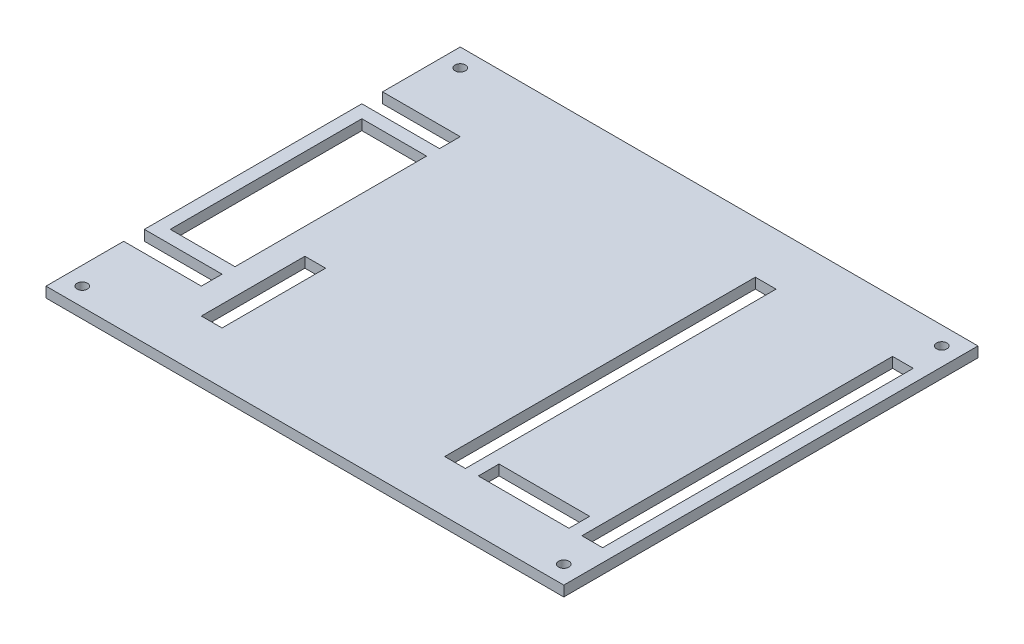
ISO-10303-21;
HEADER;
FILE_DESCRIPTION(('STEP AP214'),'2;1');
FILE_NAME('part.step','',(''),(''),'','','');
FILE_SCHEMA(('AUTOMOTIVE_DESIGN { 1 0 10303 214 1 1 1 1 }'));
ENDSEC;
DATA;
#1=APPLICATION_CONTEXT('core data for automotive mechanical design processes');
#2=APPLICATION_PROTOCOL_DEFINITION('international standard','automotive_design',2000,#1);
#3=PRODUCT_CONTEXT('',#1,'mechanical');
#4=PRODUCT('Part','Part','',(#3));
#5=PRODUCT_RELATED_PRODUCT_CATEGORY('part','',(#4));
#6=PRODUCT_DEFINITION_FORMATION('','',#4);
#7=PRODUCT_DEFINITION_CONTEXT('part definition',#1,'design');
#8=PRODUCT_DEFINITION('design','',#6,#7);
#9=PRODUCT_DEFINITION_SHAPE('','',#8);
#10=(LENGTH_UNIT() NAMED_UNIT(*) SI_UNIT(.MILLI.,.METRE.));
#11=(NAMED_UNIT(*) PLANE_ANGLE_UNIT() SI_UNIT($,.RADIAN.));
#12=(NAMED_UNIT(*) SI_UNIT($,.STERADIAN.) SOLID_ANGLE_UNIT());
#13=UNCERTAINTY_MEASURE_WITH_UNIT(LENGTH_MEASURE(1.E-05),#10,'distance_accuracy_value','');
#14=(GEOMETRIC_REPRESENTATION_CONTEXT(3) GLOBAL_UNCERTAINTY_ASSIGNED_CONTEXT((#13)) GLOBAL_UNIT_ASSIGNED_CONTEXT((#10,
#11,#12)) REPRESENTATION_CONTEXT('',''));
#15=CARTESIAN_POINT('',(0.,0.,0.));
#16=DIRECTION('',(0.,0.,1.));
#17=DIRECTION('',(1.,0.,0.));
#18=AXIS2_PLACEMENT_3D('',#15,#16,#17);
#19=CARTESIAN_POINT('',(-100.,4.,-80.));
#20=DIRECTION('',(1.,0.,0.));
#21=DIRECTION('',(0.,0.,-1.));
#22=AXIS2_PLACEMENT_3D('',#19,#20,#21);
#23=PLANE('',#22);
#24=DIRECTION('',(0.,0.,1.));
#25=VECTOR('',#24,1.);
#26=CARTESIAN_POINT('',(-100.,4.,-80.));
#27=LINE('',#26,#25);
#28=CARTESIAN_POINT('',(-100.,4.,50.));
#29=VERTEX_POINT('',#28);
#30=CARTESIAN_POINT('',(-100.,4.,80.));
#31=VERTEX_POINT('',#30);
#32=EDGE_CURVE('E478',#29,#31,#27,.T.);
#33=ORIENTED_EDGE('',*,*,#32,.F.);
#34=DIRECTION('',(0.,-1.,0.));
#35=VECTOR('',#34,1.);
#36=CARTESIAN_POINT('',(-100.,329.195252931707,50.));
#37=LINE('',#36,#35);
#38=CARTESIAN_POINT('',(-100.,0.,50.));
#39=VERTEX_POINT('',#38);
#40=EDGE_CURVE('E394',#29,#39,#37,.T.);
#41=ORIENTED_EDGE('',*,*,#40,.T.);
#42=DIRECTION('',(0.,0.,1.));
#43=VECTOR('',#42,1.);
#44=CARTESIAN_POINT('',(-100.,0.,-80.));
#45=LINE('',#44,#43);
#46=CARTESIAN_POINT('',(-100.,0.,80.));
#47=VERTEX_POINT('',#46);
#48=EDGE_CURVE('E470',#39,#47,#45,.T.);
#49=ORIENTED_EDGE('',*,*,#48,.T.);
#50=DIRECTION('',(0.,-1.,0.));
#51=VECTOR('',#50,1.);
#52=CARTESIAN_POINT('',(-100.,4.,80.));
#53=LINE('',#52,#51);
#54=EDGE_CURVE('E503',#31,#47,#53,.T.);
#55=ORIENTED_EDGE('',*,*,#54,.F.);
#56=EDGE_LOOP('',(#33,#41,#49,#55));
#57=FACE_BOUND('',#56,.T.);
#58=ADVANCED_FACE('F33',(#57),#23,.F.);
#59=CARTESIAN_POINT('',(0.,0.,0.));
#60=DIRECTION('',(0.,-1.,0.));
#61=DIRECTION('',(0.,0.,-1.));
#62=AXIS2_PLACEMENT_3D('',#59,#60,#61);
#63=PLANE('',#62);
#64=DIRECTION('',(0.,0.,-1.));
#65=VECTOR('',#64,1.);
#66=CARTESIAN_POINT('',(82.,0.,52.));
#67=LINE('',#66,#65);
#68=CARTESIAN_POINT('',(82.,0.,60.));
#69=VERTEX_POINT('',#68);
#70=CARTESIAN_POINT('',(82.,0.,52.));
#71=VERTEX_POINT('',#70);
#72=EDGE_CURVE('E244',#69,#71,#67,.T.);
#73=ORIENTED_EDGE('',*,*,#72,.T.);
#74=DIRECTION('',(-1.,0.,0.));
#75=VECTOR('',#74,1.);
#76=CARTESIAN_POINT('',(82.,0.,52.));
#77=LINE('',#76,#75);
#78=CARTESIAN_POINT('',(47.,0.,52.));
#79=VERTEX_POINT('',#78);
#80=EDGE_CURVE('E253',#71,#79,#77,.T.);
#81=ORIENTED_EDGE('',*,*,#80,.T.);
#82=DIRECTION('',(0.,0.,1.));
#83=VECTOR('',#82,1.);
#84=CARTESIAN_POINT('',(47.,0.,52.));
#85=LINE('',#84,#83);
#86=CARTESIAN_POINT('',(47.,0.,60.));
#87=VERTEX_POINT('',#86);
#88=EDGE_CURVE('E48',#79,#87,#85,.T.);
#89=ORIENTED_EDGE('',*,*,#88,.T.);
#90=DIRECTION('',(1.,0.,0.));
#91=VECTOR('',#90,1.);
#92=CARTESIAN_POINT('',(82.,0.,60.));
#93=LINE('',#92,#91);
#94=EDGE_CURVE('E250',#87,#69,#93,.T.);
#95=ORIENTED_EDGE('',*,*,#94,.T.);
#96=EDGE_LOOP('',(#73,#81,#89,#95));
#97=FACE_BOUND('',#96,.T.);
#98=DIRECTION('',(0.,0.,-1.));
#99=VECTOR('',#98,1.);
#100=CARTESIAN_POINT('',(-52.,0.,20.));
#101=LINE('',#100,#99);
#102=CARTESIAN_POINT('',(-52.,0.,60.));
#103=VERTEX_POINT('',#102);
#104=CARTESIAN_POINT('',(-52.,0.,20.));
#105=VERTEX_POINT('',#104);
#106=EDGE_CURVE('E279',#103,#105,#101,.T.);
#107=ORIENTED_EDGE('',*,*,#106,.T.);
#108=DIRECTION('',(-1.,0.,0.));
#109=VECTOR('',#108,1.);
#110=CARTESIAN_POINT('',(-52.,0.,20.));
#111=LINE('',#110,#109);
#112=CARTESIAN_POINT('',(-60.,0.,20.));
#113=VERTEX_POINT('',#112);
#114=EDGE_CURVE('E282',#105,#113,#111,.T.);
#115=ORIENTED_EDGE('',*,*,#114,.T.);
#116=DIRECTION('',(0.,0.,1.));
#117=VECTOR('',#116,1.);
#118=CARTESIAN_POINT('',(-60.,0.,20.));
#119=LINE('',#118,#117);
#120=CARTESIAN_POINT('',(-60.,0.,60.));
#121=VERTEX_POINT('',#120);
#122=EDGE_CURVE('E286',#113,#121,#119,.T.);
#123=ORIENTED_EDGE('',*,*,#122,.T.);
#124=DIRECTION('',(1.,0.,0.));
#125=VECTOR('',#124,1.);
#126=CARTESIAN_POINT('',(-52.,0.,60.));
#127=LINE('',#126,#125);
#128=EDGE_CURVE('E289',#121,#103,#127,.T.);
#129=ORIENTED_EDGE('',*,*,#128,.T.);
#130=EDGE_LOOP('',(#107,#115,#123,#129));
#131=FACE_BOUND('',#130,.T.);
#132=DIRECTION('',(0.,0.,1.));
#133=VECTOR('',#132,1.);
#134=CARTESIAN_POINT('',(34.,0.,-60.));
#135=LINE('',#134,#133);
#136=CARTESIAN_POINT('',(34.,0.,-60.));
#137=VERTEX_POINT('',#136);
#138=CARTESIAN_POINT('',(34.,0.,60.));
#139=VERTEX_POINT('',#138);
#140=EDGE_CURVE('E311',#137,#139,#135,.T.);
#141=ORIENTED_EDGE('',*,*,#140,.T.);
#142=DIRECTION('',(1.,0.,0.));
#143=VECTOR('',#142,1.);
#144=CARTESIAN_POINT('',(34.,0.,60.));
#145=LINE('',#144,#143);
#146=CARTESIAN_POINT('',(42.,0.,60.));
#147=VERTEX_POINT('',#146);
#148=EDGE_CURVE('E314',#139,#147,#145,.T.);
#149=ORIENTED_EDGE('',*,*,#148,.T.);
#150=DIRECTION('',(0.,0.,-1.));
#151=VECTOR('',#150,1.);
#152=CARTESIAN_POINT('',(42.,0.,-60.));
#153=LINE('',#152,#151);
#154=CARTESIAN_POINT('',(42.,0.,-60.));
#155=VERTEX_POINT('',#154);
#156=EDGE_CURVE('E318',#147,#155,#153,.T.);
#157=ORIENTED_EDGE('',*,*,#156,.T.);
#158=DIRECTION('',(-1.,0.,0.));
#159=VECTOR('',#158,1.);
#160=CARTESIAN_POINT('',(34.,0.,-60.));
#161=LINE('',#160,#159);
#162=EDGE_CURVE('E321',#155,#137,#161,.T.);
#163=ORIENTED_EDGE('',*,*,#162,.T.);
#164=EDGE_LOOP('',(#141,#149,#157,#163));
#165=FACE_BOUND('',#164,.T.);
#166=DIRECTION('',(-1.,0.,0.));
#167=VECTOR('',#166,1.);
#168=CARTESIAN_POINT('',(95.,0.,-60.));
#169=LINE('',#168,#167);
#170=CARTESIAN_POINT('',(95.,0.,-60.));
#171=VERTEX_POINT('',#170);
#172=CARTESIAN_POINT('',(87.,0.,-60.));
#173=VERTEX_POINT('',#172);
#174=EDGE_CURVE('E343',#171,#173,#169,.T.);
#175=ORIENTED_EDGE('',*,*,#174,.T.);
#176=DIRECTION('',(0.,0.,1.));
#177=VECTOR('',#176,1.);
#178=CARTESIAN_POINT('',(87.,0.,-60.));
#179=LINE('',#178,#177);
#180=CARTESIAN_POINT('',(87.,0.,60.));
#181=VERTEX_POINT('',#180);
#182=EDGE_CURVE('E346',#173,#181,#179,.T.);
#183=ORIENTED_EDGE('',*,*,#182,.T.);
#184=DIRECTION('',(-1.,0.,0.));
#185=VECTOR('',#184,1.);
#186=CARTESIAN_POINT('',(95.,0.,60.));
#187=LINE('',#186,#185);
#188=CARTESIAN_POINT('',(95.,0.,60.));
#189=VERTEX_POINT('',#188);
#190=EDGE_CURVE('E350',#189,#181,#187,.T.);
#191=ORIENTED_EDGE('',*,*,#190,.F.);
#192=DIRECTION('',(0.,0.,1.));
#193=VECTOR('',#192,1.);
#194=CARTESIAN_POINT('',(95.,0.,-60.));
#195=LINE('',#194,#193);
#196=EDGE_CURVE('E353',#171,#189,#195,.T.);
#197=ORIENTED_EDGE('',*,*,#196,.F.);
#198=EDGE_LOOP('',(#175,#183,#191,#197));
#199=FACE_BOUND('',#198,.T.);
#200=DIRECTION('',(0.,0.,-1.));
#201=VECTOR('',#200,1.);
#202=CARTESIAN_POINT('',(-70.,0.,37.0000000000001));
#203=LINE('',#202,#201);
#204=CARTESIAN_POINT('',(-70.,0.,37.0000000000001));
#205=VERTEX_POINT('',#204);
#206=CARTESIAN_POINT('',(-70.,0.,-37.));
#207=VERTEX_POINT('',#206);
#208=EDGE_CURVE('E401',#205,#207,#203,.T.);
#209=ORIENTED_EDGE('',*,*,#208,.T.);
#210=DIRECTION('',(-1.,0.,0.));
#211=VECTOR('',#210,1.);
#212=CARTESIAN_POINT('',(-70.,0.,-37.));
#213=LINE('',#212,#211);
#214=CARTESIAN_POINT('',(-95.,0.,-37.));
#215=VERTEX_POINT('',#214);
#216=EDGE_CURVE('E404',#207,#215,#213,.T.);
#217=ORIENTED_EDGE('',*,*,#216,.T.);
#218=DIRECTION('',(0.,0.,-1.));
#219=VECTOR('',#218,1.);
#220=CARTESIAN_POINT('',(-95.,0.,37.0000000000001));
#221=LINE('',#220,#219);
#222=CARTESIAN_POINT('',(-95.,0.,37.0000000000001));
#223=VERTEX_POINT('',#222);
#224=EDGE_CURVE('E408',#223,#215,#221,.T.);
#225=ORIENTED_EDGE('',*,*,#224,.F.);
#226=DIRECTION('',(-1.,0.,0.));
#227=VECTOR('',#226,1.);
#228=CARTESIAN_POINT('',(-70.,0.,37.0000000000001));
#229=LINE('',#228,#227);
#230=EDGE_CURVE('E411',#205,#223,#229,.T.);
#231=ORIENTED_EDGE('',*,*,#230,.F.);
#232=EDGE_LOOP('',(#209,#217,#225,#231));
#233=FACE_BOUND('',#232,.T.);
#234=CARTESIAN_POINT('',(-93.,0.,73.));
#235=DIRECTION('',(0.,1.,0.));
#236=DIRECTION('',(0.,0.,1.));
#237=AXIS2_PLACEMENT_3D('',#234,#235,#236);
#238=CIRCLE('',#237,2.);
#239=CARTESIAN_POINT('',(-93.,0.,75.));
#240=VERTEX_POINT('',#239);
#241=EDGE_CURVE('E459',#240,#240,#238,.T.);
#242=ORIENTED_EDGE('',*,*,#241,.T.);
#243=EDGE_LOOP('',(#242));
#244=FACE_BOUND('',#243,.T.);
#245=CARTESIAN_POINT('',(93.,0.,-73.));
#246=DIRECTION('',(0.,1.,0.));
#247=DIRECTION('',(0.,0.,1.));
#248=AXIS2_PLACEMENT_3D('',#245,#246,#247);
#249=CIRCLE('',#248,2.);
#250=CARTESIAN_POINT('',(93.,0.,-71.));
#251=VERTEX_POINT('',#250);
#252=EDGE_CURVE('E452',#251,#251,#249,.T.);
#253=ORIENTED_EDGE('',*,*,#252,.T.);
#254=EDGE_LOOP('',(#253));
#255=FACE_BOUND('',#254,.T.);
#256=CARTESIAN_POINT('',(-93.,0.,-73.));
#257=DIRECTION('',(0.,1.,0.));
#258=DIRECTION('',(0.,0.,1.));
#259=AXIS2_PLACEMENT_3D('',#256,#257,#258);
#260=CIRCLE('',#259,2.);
#261=CARTESIAN_POINT('',(-93.,0.,-71.));
#262=VERTEX_POINT('',#261);
#263=EDGE_CURVE('E448',#262,#262,#260,.T.);
#264=ORIENTED_EDGE('',*,*,#263,.T.);
#265=EDGE_LOOP('',(#264));
#266=FACE_BOUND('',#265,.T.);
#267=CARTESIAN_POINT('',(93.,0.,73.));
#268=DIRECTION('',(0.,1.,0.));
#269=DIRECTION('',(0.,0.,1.));
#270=AXIS2_PLACEMENT_3D('',#267,#268,#269);
#271=CIRCLE('',#270,2.);
#272=CARTESIAN_POINT('',(93.,0.,75.));
#273=VERTEX_POINT('',#272);
#274=EDGE_CURVE('E467',#273,#273,#271,.T.);
#275=ORIENTED_EDGE('',*,*,#274,.T.);
#276=EDGE_LOOP('',(#275));
#277=FACE_BOUND('',#276,.T.);
#278=DIRECTION('',(0.,0.,-1.));
#279=VECTOR('',#278,1.);
#280=CARTESIAN_POINT('',(-70.,0.,42.0000000000001));
#281=LINE('',#280,#279);
#282=CARTESIAN_POINT('',(-70.,0.,50.));
#283=VERTEX_POINT('',#282);
#284=CARTESIAN_POINT('',(-70.,0.,42.0000000000001));
#285=VERTEX_POINT('',#284);
#286=EDGE_CURVE('E378',#283,#285,#281,.T.);
#287=ORIENTED_EDGE('',*,*,#286,.T.);
#288=DIRECTION('',(-1.,0.,0.));
#289=VECTOR('',#288,1.);
#290=CARTESIAN_POINT('',(-100.,0.,42.0000000000001));
#291=LINE('',#290,#289);
#292=CARTESIAN_POINT('',(-100.,0.,42.0000000000001));
#293=VERTEX_POINT('',#292);
#294=EDGE_CURVE('E379',#285,#293,#291,.T.);
#295=ORIENTED_EDGE('',*,*,#294,.T.);
#296=CARTESIAN_POINT('',(-100.,0.,-42.));
#297=VERTEX_POINT('',#296);
#298=EDGE_CURVE('E489',#297,#293,#45,.T.);
#299=ORIENTED_EDGE('',*,*,#298,.F.);
#300=DIRECTION('',(1.,0.,0.));
#301=VECTOR('',#300,1.);
#302=CARTESIAN_POINT('',(0.,0.,-42.));
#303=LINE('',#302,#301);
#304=CARTESIAN_POINT('',(-70.,0.,-42.));
#305=VERTEX_POINT('',#304);
#306=EDGE_CURVE('E11',#297,#305,#303,.T.);
#307=ORIENTED_EDGE('',*,*,#306,.T.);
#308=DIRECTION('',(0.,0.,-1.));
#309=VECTOR('',#308,1.);
#310=CARTESIAN_POINT('',(-70.,0.,0.));
#311=LINE('',#310,#309);
#312=CARTESIAN_POINT('',(-70.,0.,-50.));
#313=VERTEX_POINT('',#312);
#314=EDGE_CURVE('E41',#305,#313,#311,.T.);
#315=ORIENTED_EDGE('',*,*,#314,.T.);
#316=DIRECTION('',(-1.,0.,0.));
#317=VECTOR('',#316,1.);
#318=CARTESIAN_POINT('',(0.,0.,-50.));
#319=LINE('',#318,#317);
#320=CARTESIAN_POINT('',(-100.,0.,-50.));
#321=VERTEX_POINT('',#320);
#322=EDGE_CURVE('E506',#313,#321,#319,.T.);
#323=ORIENTED_EDGE('',*,*,#322,.T.);
#324=CARTESIAN_POINT('',(-100.,0.,-80.));
#325=VERTEX_POINT('',#324);
#326=EDGE_CURVE('E485',#325,#321,#45,.T.);
#327=ORIENTED_EDGE('',*,*,#326,.F.);
#328=DIRECTION('',(-1.,0.,0.));
#329=VECTOR('',#328,1.);
#330=CARTESIAN_POINT('',(100.,0.,-80.));
#331=LINE('',#330,#329);
#332=CARTESIAN_POINT('',(100.,0.,-80.));
#333=VERTEX_POINT('',#332);
#334=EDGE_CURVE('E493',#333,#325,#331,.T.);
#335=ORIENTED_EDGE('',*,*,#334,.F.);
#336=DIRECTION('',(0.,0.,-1.));
#337=VECTOR('',#336,1.);
#338=CARTESIAN_POINT('',(100.,0.,-80.));
#339=LINE('',#338,#337);
#340=CARTESIAN_POINT('',(100.,0.,80.));
#341=VERTEX_POINT('',#340);
#342=EDGE_CURVE('E491',#341,#333,#339,.T.);
#343=ORIENTED_EDGE('',*,*,#342,.F.);
#344=DIRECTION('',(1.,0.,0.));
#345=VECTOR('',#344,1.);
#346=CARTESIAN_POINT('',(100.,0.,80.));
#347=LINE('',#346,#345);
#348=EDGE_CURVE('E488',#47,#341,#347,.T.);
#349=ORIENTED_EDGE('',*,*,#348,.F.);
#350=ORIENTED_EDGE('',*,*,#48,.F.);
#351=DIRECTION('',(1.,0.,0.));
#352=VECTOR('',#351,1.);
#353=CARTESIAN_POINT('',(-70.,0.,50.));
#354=LINE('',#353,#352);
#355=EDGE_CURVE('E374',#39,#283,#354,.T.);
#356=ORIENTED_EDGE('',*,*,#355,.T.);
#357=EDGE_LOOP('',(#287,#295,#299,#307,#315,#323,#327,#335,#343,#349,#350,#356));
#358=FACE_BOUND('',#357,.T.);
#359=ADVANCED_FACE('F257',(#97,#131,#165,#199,#233,#244,#255,#266,#277,#358),#63,.T.);
#360=ORIENTED_EDGE('',*,*,#298,.T.);
#361=DIRECTION('',(0.,-1.,0.));
#362=VECTOR('',#361,1.);
#363=CARTESIAN_POINT('',(-100.,329.195252931707,42.0000000000001));
#364=LINE('',#363,#362);
#365=CARTESIAN_POINT('',(-100.,4.,42.0000000000001));
#366=VERTEX_POINT('',#365);
#367=EDGE_CURVE('E377',#366,#293,#364,.T.);
#368=ORIENTED_EDGE('',*,*,#367,.F.);
#369=CARTESIAN_POINT('',(-100.,4.,-42.));
#370=VERTEX_POINT('',#369);
#371=EDGE_CURVE('E477',#370,#366,#27,.T.);
#372=ORIENTED_EDGE('',*,*,#371,.F.);
#373=DIRECTION('',(0.,-1.,0.));
#374=VECTOR('',#373,1.);
#375=CARTESIAN_POINT('',(-100.,329.195252931707,-42.));
#376=LINE('',#375,#374);
#377=EDGE_CURVE('E439',#370,#297,#376,.T.);
#378=ORIENTED_EDGE('',*,*,#377,.T.);
#379=EDGE_LOOP('',(#360,#368,#372,#378));
#380=FACE_BOUND('',#379,.T.);
#381=ADVANCED_FACE('F35',(#380),#23,.F.);
#382=DIRECTION('',(0.,-1.,0.));
#383=VECTOR('',#382,1.);
#384=CARTESIAN_POINT('',(-100.,329.195252931707,-50.));
#385=LINE('',#384,#383);
#386=CARTESIAN_POINT('',(-100.,4.,-50.));
#387=VERTEX_POINT('',#386);
#388=EDGE_CURVE('E432',#387,#321,#385,.T.);
#389=ORIENTED_EDGE('',*,*,#388,.F.);
#390=CARTESIAN_POINT('',(-100.,4.,-80.));
#391=VERTEX_POINT('',#390);
#392=EDGE_CURVE('E473',#391,#387,#27,.T.);
#393=ORIENTED_EDGE('',*,*,#392,.F.);
#394=DIRECTION('',(0.,-1.,0.));
#395=VECTOR('',#394,1.);
#396=CARTESIAN_POINT('',(-100.,4.,-80.));
#397=LINE('',#396,#395);
#398=EDGE_CURVE('E484',#391,#325,#397,.T.);
#399=ORIENTED_EDGE('',*,*,#398,.T.);
#400=ORIENTED_EDGE('',*,*,#326,.T.);
#401=EDGE_LOOP('',(#389,#393,#399,#400));
#402=FACE_BOUND('',#401,.T.);
#403=ADVANCED_FACE('F553',(#402),#23,.F.);
#404=CARTESIAN_POINT('',(0.,4.,0.));
#405=DIRECTION('',(0.,-1.,0.));
#406=DIRECTION('',(0.,0.,-1.));
#407=AXIS2_PLACEMENT_3D('',#404,#405,#406);
#408=PLANE('',#407);
#409=DIRECTION('',(-1.,0.,0.));
#410=VECTOR('',#409,1.);
#411=CARTESIAN_POINT('',(82.,4.,52.));
#412=LINE('',#411,#410);
#413=CARTESIAN_POINT('',(82.,4.,52.));
#414=VERTEX_POINT('',#413);
#415=CARTESIAN_POINT('',(47.,4.,52.));
#416=VERTEX_POINT('',#415);
#417=EDGE_CURVE('E269',#414,#416,#412,.T.);
#418=ORIENTED_EDGE('',*,*,#417,.F.);
#419=DIRECTION('',(0.,0.,-1.));
#420=VECTOR('',#419,1.);
#421=CARTESIAN_POINT('',(82.,4.,52.));
#422=LINE('',#421,#420);
#423=CARTESIAN_POINT('',(82.,4.,60.));
#424=VERTEX_POINT('',#423);
#425=EDGE_CURVE('E56',#424,#414,#422,.T.);
#426=ORIENTED_EDGE('',*,*,#425,.F.);
#427=DIRECTION('',(1.,0.,0.));
#428=VECTOR('',#427,1.);
#429=CARTESIAN_POINT('',(82.,4.,60.));
#430=LINE('',#429,#428);
#431=CARTESIAN_POINT('',(47.,4.,60.));
#432=VERTEX_POINT('',#431);
#433=EDGE_CURVE('E260',#432,#424,#430,.T.);
#434=ORIENTED_EDGE('',*,*,#433,.F.);
#435=DIRECTION('',(0.,0.,1.));
#436=VECTOR('',#435,1.);
#437=CARTESIAN_POINT('',(47.,4.,52.));
#438=LINE('',#437,#436);
#439=EDGE_CURVE('E263',#416,#432,#438,.T.);
#440=ORIENTED_EDGE('',*,*,#439,.F.);
#441=EDGE_LOOP('',(#418,#426,#434,#440));
#442=FACE_BOUND('',#441,.T.);
#443=DIRECTION('',(-1.,0.,0.));
#444=VECTOR('',#443,1.);
#445=CARTESIAN_POINT('',(-52.,4.,20.));
#446=LINE('',#445,#444);
#447=CARTESIAN_POINT('',(-52.,4.,20.));
#448=VERTEX_POINT('',#447);
#449=CARTESIAN_POINT('',(-60.,4.,20.));
#450=VERTEX_POINT('',#449);
#451=EDGE_CURVE('E294',#448,#450,#446,.T.);
#452=ORIENTED_EDGE('',*,*,#451,.F.);
#453=DIRECTION('',(0.,0.,-1.));
#454=VECTOR('',#453,1.);
#455=CARTESIAN_POINT('',(-52.,4.,20.));
#456=LINE('',#455,#454);
#457=CARTESIAN_POINT('',(-52.,4.,60.));
#458=VERTEX_POINT('',#457);
#459=EDGE_CURVE('E275',#458,#448,#456,.T.);
#460=ORIENTED_EDGE('',*,*,#459,.F.);
#461=DIRECTION('',(1.,0.,0.));
#462=VECTOR('',#461,1.);
#463=CARTESIAN_POINT('',(-52.,4.,60.));
#464=LINE('',#463,#462);
#465=CARTESIAN_POINT('',(-60.,4.,60.));
#466=VERTEX_POINT('',#465);
#467=EDGE_CURVE('E283',#466,#458,#464,.T.);
#468=ORIENTED_EDGE('',*,*,#467,.F.);
#469=DIRECTION('',(0.,0.,1.));
#470=VECTOR('',#469,1.);
#471=CARTESIAN_POINT('',(-60.,4.,20.));
#472=LINE('',#471,#470);
#473=EDGE_CURVE('E297',#450,#466,#472,.T.);
#474=ORIENTED_EDGE('',*,*,#473,.F.);
#475=EDGE_LOOP('',(#452,#460,#468,#474));
#476=FACE_BOUND('',#475,.T.);
#477=DIRECTION('',(1.,0.,0.));
#478=VECTOR('',#477,1.);
#479=CARTESIAN_POINT('',(34.,4.,60.));
#480=LINE('',#479,#478);
#481=CARTESIAN_POINT('',(34.,4.,60.));
#482=VERTEX_POINT('',#481);
#483=CARTESIAN_POINT('',(42.,4.,60.));
#484=VERTEX_POINT('',#483);
#485=EDGE_CURVE('E326',#482,#484,#480,.T.);
#486=ORIENTED_EDGE('',*,*,#485,.F.);
#487=DIRECTION('',(0.,0.,1.));
#488=VECTOR('',#487,1.);
#489=CARTESIAN_POINT('',(34.,4.,-60.));
#490=LINE('',#489,#488);
#491=CARTESIAN_POINT('',(34.,4.,-60.));
#492=VERTEX_POINT('',#491);
#493=EDGE_CURVE('E304',#492,#482,#490,.T.);
#494=ORIENTED_EDGE('',*,*,#493,.F.);
#495=DIRECTION('',(-1.,0.,0.));
#496=VECTOR('',#495,1.);
#497=CARTESIAN_POINT('',(34.,4.,-60.));
#498=LINE('',#497,#496);
#499=CARTESIAN_POINT('',(42.,4.,-60.));
#500=VERTEX_POINT('',#499);
#501=EDGE_CURVE('E315',#500,#492,#498,.T.);
#502=ORIENTED_EDGE('',*,*,#501,.F.);
#503=DIRECTION('',(0.,0.,-1.));
#504=VECTOR('',#503,1.);
#505=CARTESIAN_POINT('',(42.,4.,-60.));
#506=LINE('',#505,#504);
#507=EDGE_CURVE('E329',#484,#500,#506,.T.);
#508=ORIENTED_EDGE('',*,*,#507,.F.);
#509=EDGE_LOOP('',(#486,#494,#502,#508));
#510=FACE_BOUND('',#509,.T.);
#511=DIRECTION('',(0.,0.,1.));
#512=VECTOR('',#511,1.);
#513=CARTESIAN_POINT('',(87.,4.,-60.));
#514=LINE('',#513,#512);
#515=CARTESIAN_POINT('',(87.,4.,-60.));
#516=VERTEX_POINT('',#515);
#517=CARTESIAN_POINT('',(87.,4.,60.));
#518=VERTEX_POINT('',#517);
#519=EDGE_CURVE('E357',#516,#518,#514,.T.);
#520=ORIENTED_EDGE('',*,*,#519,.F.);
#521=DIRECTION('',(-1.,0.,0.));
#522=VECTOR('',#521,1.);
#523=CARTESIAN_POINT('',(95.,4.,-60.));
#524=LINE('',#523,#522);
#525=CARTESIAN_POINT('',(95.,4.,-60.));
#526=VERTEX_POINT('',#525);
#527=EDGE_CURVE('E336',#526,#516,#524,.T.);
#528=ORIENTED_EDGE('',*,*,#527,.F.);
#529=DIRECTION('',(0.,0.,1.));
#530=VECTOR('',#529,1.);
#531=CARTESIAN_POINT('',(95.,4.,-60.));
#532=LINE('',#531,#530);
#533=CARTESIAN_POINT('',(95.,4.,60.));
#534=VERTEX_POINT('',#533);
#535=EDGE_CURVE('E347',#526,#534,#532,.T.);
#536=ORIENTED_EDGE('',*,*,#535,.T.);
#537=DIRECTION('',(-1.,0.,0.));
#538=VECTOR('',#537,1.);
#539=CARTESIAN_POINT('',(95.,4.,60.));
#540=LINE('',#539,#538);
#541=EDGE_CURVE('E360',#534,#518,#540,.T.);
#542=ORIENTED_EDGE('',*,*,#541,.T.);
#543=EDGE_LOOP('',(#520,#528,#536,#542));
#544=FACE_BOUND('',#543,.T.);
#545=DIRECTION('',(-1.,0.,0.));
#546=VECTOR('',#545,1.);
#547=CARTESIAN_POINT('',(-70.,4.,-37.));
#548=LINE('',#547,#546);
#549=CARTESIAN_POINT('',(-70.,4.,-37.));
#550=VERTEX_POINT('',#549);
#551=CARTESIAN_POINT('',(-95.,4.,-37.));
#552=VERTEX_POINT('',#551);
#553=EDGE_CURVE('E415',#550,#552,#548,.T.);
#554=ORIENTED_EDGE('',*,*,#553,.F.);
#555=DIRECTION('',(0.,0.,-1.));
#556=VECTOR('',#555,1.);
#557=CARTESIAN_POINT('',(-70.,4.,37.0000000000001));
#558=LINE('',#557,#556);
#559=CARTESIAN_POINT('',(-70.,4.,37.0000000000001));
#560=VERTEX_POINT('',#559);
#561=EDGE_CURVE('E400',#560,#550,#558,.T.);
#562=ORIENTED_EDGE('',*,*,#561,.F.);
#563=DIRECTION('',(-1.,0.,0.));
#564=VECTOR('',#563,1.);
#565=CARTESIAN_POINT('',(-70.,4.,37.0000000000001));
#566=LINE('',#565,#564);
#567=CARTESIAN_POINT('',(-95.,4.,37.0000000000001));
#568=VERTEX_POINT('',#567);
#569=EDGE_CURVE('E405',#560,#568,#566,.T.);
#570=ORIENTED_EDGE('',*,*,#569,.T.);
#571=DIRECTION('',(0.,0.,-1.));
#572=VECTOR('',#571,1.);
#573=CARTESIAN_POINT('',(-95.,4.,37.0000000000001));
#574=LINE('',#573,#572);
#575=EDGE_CURVE('E418',#568,#552,#574,.T.);
#576=ORIENTED_EDGE('',*,*,#575,.T.);
#577=EDGE_LOOP('',(#554,#562,#570,#576));
#578=FACE_BOUND('',#577,.T.);
#579=CARTESIAN_POINT('',(93.,4.,73.));
#580=DIRECTION('',(0.,1.,0.));
#581=DIRECTION('',(0.,0.,1.));
#582=AXIS2_PLACEMENT_3D('',#579,#580,#581);
#583=CIRCLE('',#582,2.);
#584=CARTESIAN_POINT('',(93.,4.,75.));
#585=VERTEX_POINT('',#584);
#586=EDGE_CURVE('E458',#585,#585,#583,.T.);
#587=ORIENTED_EDGE('',*,*,#586,.F.);
#588=EDGE_LOOP('',(#587));
#589=FACE_BOUND('',#588,.T.);
#590=CARTESIAN_POINT('',(-93.,4.,-73.));
#591=DIRECTION('',(0.,1.,0.));
#592=DIRECTION('',(0.,0.,1.));
#593=AXIS2_PLACEMENT_3D('',#590,#591,#592);
#594=CIRCLE('',#593,2.);
#595=CARTESIAN_POINT('',(-93.,4.,-71.));
#596=VERTEX_POINT('',#595);
#597=EDGE_CURVE('E449',#596,#596,#594,.T.);
#598=ORIENTED_EDGE('',*,*,#597,.F.);
#599=EDGE_LOOP('',(#598));
#600=FACE_BOUND('',#599,.T.);
#601=CARTESIAN_POINT('',(93.,4.,-73.));
#602=DIRECTION('',(0.,1.,0.));
#603=DIRECTION('',(0.,0.,1.));
#604=AXIS2_PLACEMENT_3D('',#601,#602,#603);
#605=CIRCLE('',#604,2.);
#606=CARTESIAN_POINT('',(93.,4.,-71.));
#607=VERTEX_POINT('',#606);
#608=EDGE_CURVE('E462',#607,#607,#605,.T.);
#609=ORIENTED_EDGE('',*,*,#608,.F.);
#610=EDGE_LOOP('',(#609));
#611=FACE_BOUND('',#610,.T.);
#612=CARTESIAN_POINT('',(-93.,4.,73.));
#613=DIRECTION('',(0.,1.,0.));
#614=DIRECTION('',(0.,0.,1.));
#615=AXIS2_PLACEMENT_3D('',#612,#613,#614);
#616=CIRCLE('',#615,2.);
#617=CARTESIAN_POINT('',(-93.,4.,75.));
#618=VERTEX_POINT('',#617);
#619=EDGE_CURVE('E455',#618,#618,#616,.T.);
#620=ORIENTED_EDGE('',*,*,#619,.F.);
#621=EDGE_LOOP('',(#620));
#622=FACE_BOUND('',#621,.T.);
#623=DIRECTION('',(0.,0.,-1.));
#624=VECTOR('',#623,1.);
#625=CARTESIAN_POINT('',(-70.,4.,42.0000000000001));
#626=LINE('',#625,#624);
#627=CARTESIAN_POINT('',(-70.,4.,50.));
#628=VERTEX_POINT('',#627);
#629=CARTESIAN_POINT('',(-70.,4.,42.0000000000001));
#630=VERTEX_POINT('',#629);
#631=EDGE_CURVE('E387',#628,#630,#626,.T.);
#632=ORIENTED_EDGE('',*,*,#631,.F.);
#633=DIRECTION('',(1.,0.,0.));
#634=VECTOR('',#633,1.);
#635=CARTESIAN_POINT('',(-70.,4.,50.));
#636=LINE('',#635,#634);
#637=EDGE_CURVE('E367',#29,#628,#636,.T.);
#638=ORIENTED_EDGE('',*,*,#637,.F.);
#639=ORIENTED_EDGE('',*,*,#32,.T.);
#640=DIRECTION('',(1.,0.,0.));
#641=VECTOR('',#640,1.);
#642=CARTESIAN_POINT('',(100.,4.,80.));
#643=LINE('',#642,#641);
#644=CARTESIAN_POINT('',(100.,4.,80.));
#645=VERTEX_POINT('',#644);
#646=EDGE_CURVE('E476',#31,#645,#643,.T.);
#647=ORIENTED_EDGE('',*,*,#646,.T.);
#648=DIRECTION('',(0.,0.,-1.));
#649=VECTOR('',#648,1.);
#650=CARTESIAN_POINT('',(100.,4.,-80.));
#651=LINE('',#650,#649);
#652=CARTESIAN_POINT('',(100.,4.,-80.));
#653=VERTEX_POINT('',#652);
#654=EDGE_CURVE('E480',#645,#653,#651,.T.);
#655=ORIENTED_EDGE('',*,*,#654,.T.);
#656=DIRECTION('',(-1.,0.,0.));
#657=VECTOR('',#656,1.);
#658=CARTESIAN_POINT('',(100.,4.,-80.));
#659=LINE('',#658,#657);
#660=EDGE_CURVE('E482',#653,#391,#659,.T.);
#661=ORIENTED_EDGE('',*,*,#660,.T.);
#662=ORIENTED_EDGE('',*,*,#392,.T.);
#663=DIRECTION('',(-1.,0.,0.));
#664=VECTOR('',#663,1.);
#665=CARTESIAN_POINT('',(0.,4.,-50.));
#666=LINE('',#665,#664);
#667=CARTESIAN_POINT('',(-70.,4.,-50.));
#668=VERTEX_POINT('',#667);
#669=EDGE_CURVE('E442',#668,#387,#666,.T.);
#670=ORIENTED_EDGE('',*,*,#669,.F.);
#671=DIRECTION('',(0.,0.,-1.));
#672=VECTOR('',#671,1.);
#673=CARTESIAN_POINT('',(-70.,4.,0.));
#674=LINE('',#673,#672);
#675=CARTESIAN_POINT('',(-70.,4.,-42.));
#676=VERTEX_POINT('',#675);
#677=EDGE_CURVE('E444',#676,#668,#674,.T.);
#678=ORIENTED_EDGE('',*,*,#677,.F.);
#679=DIRECTION('',(1.,0.,0.));
#680=VECTOR('',#679,1.);
#681=CARTESIAN_POINT('',(0.,4.,-42.));
#682=LINE('',#681,#680);
#683=EDGE_CURVE('E446',#370,#676,#682,.T.);
#684=ORIENTED_EDGE('',*,*,#683,.F.);
#685=ORIENTED_EDGE('',*,*,#371,.T.);
#686=DIRECTION('',(-1.,0.,0.));
#687=VECTOR('',#686,1.);
#688=CARTESIAN_POINT('',(-100.,4.,42.0000000000001));
#689=LINE('',#688,#687);
#690=EDGE_CURVE('E382',#630,#366,#689,.T.);
#691=ORIENTED_EDGE('',*,*,#690,.F.);
#692=EDGE_LOOP('',(#632,#638,#639,#647,#655,#661,#662,#670,#678,#684,#685,#691));
#693=FACE_BOUND('',#692,.T.);
#694=ADVANCED_FACE('F524',(#442,#476,#510,#544,#578,#589,#600,#611,#622,#693),#408,.F.);
#695=CARTESIAN_POINT('',(100.,4.,80.));
#696=DIRECTION('',(0.,0.,-1.));
#697=DIRECTION('',(-1.,0.,0.));
#698=AXIS2_PLACEMENT_3D('',#695,#696,#697);
#699=PLANE('',#698);
#700=ORIENTED_EDGE('',*,*,#348,.T.);
#701=DIRECTION('',(0.,-1.,0.));
#702=VECTOR('',#701,1.);
#703=CARTESIAN_POINT('',(100.,4.,80.));
#704=LINE('',#703,#702);
#705=EDGE_CURVE('E500',#645,#341,#704,.T.);
#706=ORIENTED_EDGE('',*,*,#705,.F.);
#707=ORIENTED_EDGE('',*,*,#646,.F.);
#708=ORIENTED_EDGE('',*,*,#54,.T.);
#709=EDGE_LOOP('',(#700,#706,#707,#708));
#710=FACE_BOUND('',#709,.T.);
#711=ADVANCED_FACE('F537',(#710),#699,.F.);
#712=CARTESIAN_POINT('',(100.,4.,-80.));
#713=DIRECTION('',(-1.,0.,0.));
#714=DIRECTION('',(0.,0.,1.));
#715=AXIS2_PLACEMENT_3D('',#712,#713,#714);
#716=PLANE('',#715);
#717=ORIENTED_EDGE('',*,*,#342,.T.);
#718=DIRECTION('',(0.,-1.,0.));
#719=VECTOR('',#718,1.);
#720=CARTESIAN_POINT('',(100.,4.,-80.));
#721=LINE('',#720,#719);
#722=EDGE_CURVE('E497',#653,#333,#721,.T.);
#723=ORIENTED_EDGE('',*,*,#722,.F.);
#724=ORIENTED_EDGE('',*,*,#654,.F.);
#725=ORIENTED_EDGE('',*,*,#705,.T.);
#726=EDGE_LOOP('',(#717,#723,#724,#725));
#727=FACE_BOUND('',#726,.T.);
#728=ADVANCED_FACE('F544',(#727),#716,.F.);
#729=CARTESIAN_POINT('',(100.,4.,-80.));
#730=DIRECTION('',(0.,0.,1.));
#731=DIRECTION('',(1.,0.,0.));
#732=AXIS2_PLACEMENT_3D('',#729,#730,#731);
#733=PLANE('',#732);
#734=ORIENTED_EDGE('',*,*,#334,.T.);
#735=ORIENTED_EDGE('',*,*,#398,.F.);
#736=ORIENTED_EDGE('',*,*,#660,.F.);
#737=ORIENTED_EDGE('',*,*,#722,.T.);
#738=EDGE_LOOP('',(#734,#735,#736,#737));
#739=FACE_BOUND('',#738,.T.);
#740=ADVANCED_FACE('F550',(#739),#733,.F.);
#741=CARTESIAN_POINT('',(93.,0.,73.));
#742=DIRECTION('',(0.,1.,0.));
#743=DIRECTION('',(0.,0.,1.));
#744=AXIS2_PLACEMENT_3D('',#741,#742,#743);
#745=CYLINDRICAL_SURFACE('',#744,2.);
#746=ORIENTED_EDGE('',*,*,#274,.F.);
#747=EDGE_LOOP('',(#746));
#748=FACE_BOUND('',#747,.T.);
#749=ORIENTED_EDGE('',*,*,#586,.T.);
#750=EDGE_LOOP('',(#749));
#751=FACE_BOUND('',#750,.T.);
#752=ADVANCED_FACE('F610',(#748,#751),#745,.F.);
#753=CARTESIAN_POINT('',(-93.,0.,-73.));
#754=DIRECTION('',(0.,1.,0.));
#755=DIRECTION('',(0.,0.,1.));
#756=AXIS2_PLACEMENT_3D('',#753,#754,#755);
#757=CYLINDRICAL_SURFACE('',#756,2.);
#758=ORIENTED_EDGE('',*,*,#263,.F.);
#759=EDGE_LOOP('',(#758));
#760=FACE_BOUND('',#759,.T.);
#761=ORIENTED_EDGE('',*,*,#597,.T.);
#762=EDGE_LOOP('',(#761));
#763=FACE_BOUND('',#762,.T.);
#764=ADVANCED_FACE('F617',(#760,#763),#757,.F.);
#765=CARTESIAN_POINT('',(93.,0.,-73.));
#766=DIRECTION('',(0.,1.,0.));
#767=DIRECTION('',(0.,0.,1.));
#768=AXIS2_PLACEMENT_3D('',#765,#766,#767);
#769=CYLINDRICAL_SURFACE('',#768,2.);
#770=ORIENTED_EDGE('',*,*,#252,.F.);
#771=EDGE_LOOP('',(#770));
#772=FACE_BOUND('',#771,.T.);
#773=ORIENTED_EDGE('',*,*,#608,.T.);
#774=EDGE_LOOP('',(#773));
#775=FACE_BOUND('',#774,.T.);
#776=ADVANCED_FACE('F625',(#772,#775),#769,.F.);
#777=CARTESIAN_POINT('',(-93.,0.,73.));
#778=DIRECTION('',(0.,1.,0.));
#779=DIRECTION('',(0.,0.,1.));
#780=AXIS2_PLACEMENT_3D('',#777,#778,#779);
#781=CYLINDRICAL_SURFACE('',#780,2.);
#782=ORIENTED_EDGE('',*,*,#241,.F.);
#783=EDGE_LOOP('',(#782));
#784=FACE_BOUND('',#783,.T.);
#785=ORIENTED_EDGE('',*,*,#619,.T.);
#786=EDGE_LOOP('',(#785));
#787=FACE_BOUND('',#786,.T.);
#788=ADVANCED_FACE('F633',(#784,#787),#781,.F.);
#789=CARTESIAN_POINT('',(-100.,329.195252931707,-42.));
#790=DIRECTION('',(0.,0.,-1.));
#791=DIRECTION('',(-1.,0.,0.));
#792=AXIS2_PLACEMENT_3D('',#789,#790,#791);
#793=PLANE('',#792);
#794=ORIENTED_EDGE('',*,*,#377,.F.);
#795=ORIENTED_EDGE('',*,*,#683,.T.);
#796=DIRECTION('',(0.,-1.,0.));
#797=VECTOR('',#796,1.);
#798=CARTESIAN_POINT('',(-70.,329.195252931707,-42.));
#799=LINE('',#798,#797);
#800=EDGE_CURVE('E434',#676,#305,#799,.T.);
#801=ORIENTED_EDGE('',*,*,#800,.T.);
#802=ORIENTED_EDGE('',*,*,#306,.F.);
#803=EDGE_LOOP('',(#794,#795,#801,#802));
#804=FACE_BOUND('',#803,.T.);
#805=ADVANCED_FACE('F518',(#804),#793,.T.);
#806=CARTESIAN_POINT('',(-70.,329.195252931707,-42.));
#807=DIRECTION('',(-1.,0.,0.));
#808=DIRECTION('',(0.,0.,1.));
#809=AXIS2_PLACEMENT_3D('',#806,#807,#808);
#810=PLANE('',#809);
#811=ORIENTED_EDGE('',*,*,#800,.F.);
#812=ORIENTED_EDGE('',*,*,#677,.T.);
#813=DIRECTION('',(0.,-1.,0.));
#814=VECTOR('',#813,1.);
#815=CARTESIAN_POINT('',(-70.,329.195252931707,-50.));
#816=LINE('',#815,#814);
#817=EDGE_CURVE('E425',#668,#313,#816,.T.);
#818=ORIENTED_EDGE('',*,*,#817,.T.);
#819=ORIENTED_EDGE('',*,*,#314,.F.);
#820=EDGE_LOOP('',(#811,#812,#818,#819));
#821=FACE_BOUND('',#820,.T.);
#822=ADVANCED_FACE('F514',(#821),#810,.T.);
#823=CARTESIAN_POINT('',(-70.,329.195252931707,-50.));
#824=DIRECTION('',(0.,0.,1.));
#825=DIRECTION('',(1.,0.,0.));
#826=AXIS2_PLACEMENT_3D('',#823,#824,#825);
#827=PLANE('',#826);
#828=ORIENTED_EDGE('',*,*,#817,.F.);
#829=ORIENTED_EDGE('',*,*,#669,.T.);
#830=ORIENTED_EDGE('',*,*,#388,.T.);
#831=ORIENTED_EDGE('',*,*,#322,.F.);
#832=EDGE_LOOP('',(#828,#829,#830,#831));
#833=FACE_BOUND('',#832,.T.);
#834=ADVANCED_FACE('F555',(#833),#827,.T.);
#835=CARTESIAN_POINT('',(-70.,0.,37.0000000000001));
#836=DIRECTION('',(1.,0.,0.));
#837=DIRECTION('',(0.,0.,-1.));
#838=AXIS2_PLACEMENT_3D('',#835,#836,#837);
#839=PLANE('',#838);
#840=ORIENTED_EDGE('',*,*,#561,.T.);
#841=DIRECTION('',(0.,1.,0.));
#842=VECTOR('',#841,1.);
#843=CARTESIAN_POINT('',(-70.,0.,-37.));
#844=LINE('',#843,#842);
#845=EDGE_CURVE('E413',#207,#550,#844,.T.);
#846=ORIENTED_EDGE('',*,*,#845,.F.);
#847=ORIENTED_EDGE('',*,*,#208,.F.);
#848=DIRECTION('',(0.,1.,0.));
#849=VECTOR('',#848,1.);
#850=CARTESIAN_POINT('',(-70.,0.,37.0000000000001));
#851=LINE('',#850,#849);
#852=EDGE_CURVE('E423',#205,#560,#851,.T.);
#853=ORIENTED_EDGE('',*,*,#852,.T.);
#854=EDGE_LOOP('',(#840,#846,#847,#853));
#855=FACE_BOUND('',#854,.T.);
#856=ADVANCED_FACE('F557',(#855),#839,.F.);
#857=CARTESIAN_POINT('',(-70.,0.,37.0000000000001));
#858=DIRECTION('',(0.,0.,-1.));
#859=DIRECTION('',(-1.,0.,0.));
#860=AXIS2_PLACEMENT_3D('',#857,#858,#859);
#861=PLANE('',#860);
#862=ORIENTED_EDGE('',*,*,#569,.F.);
#863=ORIENTED_EDGE('',*,*,#852,.F.);
#864=ORIENTED_EDGE('',*,*,#230,.T.);
#865=DIRECTION('',(0.,1.,0.));
#866=VECTOR('',#865,1.);
#867=CARTESIAN_POINT('',(-95.,0.,37.0000000000001));
#868=LINE('',#867,#866);
#869=EDGE_CURVE('E426',#223,#568,#868,.T.);
#870=ORIENTED_EDGE('',*,*,#869,.T.);
#871=EDGE_LOOP('',(#862,#863,#864,#870));
#872=FACE_BOUND('',#871,.T.);
#873=ADVANCED_FACE('F563',(#872),#861,.T.);
#874=CARTESIAN_POINT('',(-95.,0.,37.0000000000001));
#875=DIRECTION('',(1.,0.,0.));
#876=DIRECTION('',(0.,0.,-1.));
#877=AXIS2_PLACEMENT_3D('',#874,#875,#876);
#878=PLANE('',#877);
#879=ORIENTED_EDGE('',*,*,#575,.F.);
#880=ORIENTED_EDGE('',*,*,#869,.F.);
#881=ORIENTED_EDGE('',*,*,#224,.T.);
#882=DIRECTION('',(0.,1.,0.));
#883=VECTOR('',#882,1.);
#884=CARTESIAN_POINT('',(-95.,0.,-37.));
#885=LINE('',#884,#883);
#886=EDGE_CURVE('E428',#215,#552,#885,.T.);
#887=ORIENTED_EDGE('',*,*,#886,.T.);
#888=EDGE_LOOP('',(#879,#880,#881,#887));
#889=FACE_BOUND('',#888,.T.);
#890=ADVANCED_FACE('F669',(#889),#878,.T.);
#891=CARTESIAN_POINT('',(-70.,0.,-37.));
#892=DIRECTION('',(0.,0.,-1.));
#893=DIRECTION('',(-1.,0.,0.));
#894=AXIS2_PLACEMENT_3D('',#891,#892,#893);
#895=PLANE('',#894);
#896=ORIENTED_EDGE('',*,*,#553,.T.);
#897=ORIENTED_EDGE('',*,*,#886,.F.);
#898=ORIENTED_EDGE('',*,*,#216,.F.);
#899=ORIENTED_EDGE('',*,*,#845,.T.);
#900=EDGE_LOOP('',(#896,#897,#898,#899));
#901=FACE_BOUND('',#900,.T.);
#902=ADVANCED_FACE('F679',(#901),#895,.F.);
#903=CARTESIAN_POINT('',(-70.,329.195252931707,50.));
#904=DIRECTION('',(0.,0.,1.));
#905=DIRECTION('',(1.,0.,0.));
#906=AXIS2_PLACEMENT_3D('',#903,#904,#905);
#907=PLANE('',#906);
#908=ORIENTED_EDGE('',*,*,#637,.T.);
#909=DIRECTION('',(0.,-1.,0.));
#910=VECTOR('',#909,1.);
#911=CARTESIAN_POINT('',(-70.,329.195252931707,50.));
#912=LINE('',#911,#910);
#913=EDGE_CURVE('E397',#628,#283,#912,.T.);
#914=ORIENTED_EDGE('',*,*,#913,.T.);
#915=ORIENTED_EDGE('',*,*,#355,.F.);
#916=ORIENTED_EDGE('',*,*,#40,.F.);
#917=EDGE_LOOP('',(#908,#914,#915,#916));
#918=FACE_BOUND('',#917,.T.);
#919=ADVANCED_FACE('F688',(#918),#907,.F.);
#920=CARTESIAN_POINT('',(-70.,329.195252931707,42.0000000000001));
#921=DIRECTION('',(1.,0.,0.));
#922=DIRECTION('',(0.,0.,-1.));
#923=AXIS2_PLACEMENT_3D('',#920,#921,#922);
#924=PLANE('',#923);
#925=ORIENTED_EDGE('',*,*,#631,.T.);
#926=DIRECTION('',(0.,-1.,0.));
#927=VECTOR('',#926,1.);
#928=CARTESIAN_POINT('',(-70.,329.195252931707,42.0000000000001));
#929=LINE('',#928,#927);
#930=EDGE_CURVE('E392',#630,#285,#929,.T.);
#931=ORIENTED_EDGE('',*,*,#930,.T.);
#932=ORIENTED_EDGE('',*,*,#286,.F.);
#933=ORIENTED_EDGE('',*,*,#913,.F.);
#934=EDGE_LOOP('',(#925,#931,#932,#933));
#935=FACE_BOUND('',#934,.T.);
#936=ADVANCED_FACE('F706',(#935),#924,.F.);
#937=CARTESIAN_POINT('',(-100.,329.195252931707,42.0000000000001));
#938=DIRECTION('',(0.,0.,-1.));
#939=DIRECTION('',(-1.,0.,0.));
#940=AXIS2_PLACEMENT_3D('',#937,#938,#939);
#941=PLANE('',#940);
#942=ORIENTED_EDGE('',*,*,#690,.T.);
#943=ORIENTED_EDGE('',*,*,#367,.T.);
#944=ORIENTED_EDGE('',*,*,#294,.F.);
#945=ORIENTED_EDGE('',*,*,#930,.F.);
#946=EDGE_LOOP('',(#942,#943,#944,#945));
#947=FACE_BOUND('',#946,.T.);
#948=ADVANCED_FACE('F715',(#947),#941,.F.);
#949=CARTESIAN_POINT('',(95.,0.,-60.));
#950=DIRECTION('',(0.,0.,-1.));
#951=DIRECTION('',(-1.,0.,0.));
#952=AXIS2_PLACEMENT_3D('',#949,#950,#951);
#953=PLANE('',#952);
#954=ORIENTED_EDGE('',*,*,#527,.T.);
#955=DIRECTION('',(0.,1.,0.));
#956=VECTOR('',#955,1.);
#957=CARTESIAN_POINT('',(87.,0.,-60.));
#958=LINE('',#957,#956);
#959=EDGE_CURVE('E355',#173,#516,#958,.T.);
#960=ORIENTED_EDGE('',*,*,#959,.F.);
#961=ORIENTED_EDGE('',*,*,#174,.F.);
#962=DIRECTION('',(0.,1.,0.));
#963=VECTOR('',#962,1.);
#964=CARTESIAN_POINT('',(95.,0.,-60.));
#965=LINE('',#964,#963);
#966=EDGE_CURVE('E365',#171,#526,#965,.T.);
#967=ORIENTED_EDGE('',*,*,#966,.T.);
#968=EDGE_LOOP('',(#954,#960,#961,#967));
#969=FACE_BOUND('',#968,.T.);
#970=ADVANCED_FACE('F724',(#969),#953,.F.);
#971=CARTESIAN_POINT('',(95.,0.,-60.));
#972=DIRECTION('',(-1.,0.,0.));
#973=DIRECTION('',(0.,0.,1.));
#974=AXIS2_PLACEMENT_3D('',#971,#972,#973);
#975=PLANE('',#974);
#976=ORIENTED_EDGE('',*,*,#535,.F.);
#977=ORIENTED_EDGE('',*,*,#966,.F.);
#978=ORIENTED_EDGE('',*,*,#196,.T.);
#979=DIRECTION('',(0.,1.,0.));
#980=VECTOR('',#979,1.);
#981=CARTESIAN_POINT('',(95.,0.,60.));
#982=LINE('',#981,#980);
#983=EDGE_CURVE('E368',#189,#534,#982,.T.);
#984=ORIENTED_EDGE('',*,*,#983,.T.);
#985=EDGE_LOOP('',(#976,#977,#978,#984));
#986=FACE_BOUND('',#985,.T.);
#987=ADVANCED_FACE('F733',(#986),#975,.T.);
#988=CARTESIAN_POINT('',(95.,0.,60.));
#989=DIRECTION('',(0.,0.,-1.));
#990=DIRECTION('',(-1.,0.,0.));
#991=AXIS2_PLACEMENT_3D('',#988,#989,#990);
#992=PLANE('',#991);
#993=ORIENTED_EDGE('',*,*,#541,.F.);
#994=ORIENTED_EDGE('',*,*,#983,.F.);
#995=ORIENTED_EDGE('',*,*,#190,.T.);
#996=DIRECTION('',(0.,1.,0.));
#997=VECTOR('',#996,1.);
#998=CARTESIAN_POINT('',(87.,0.,60.));
#999=LINE('',#998,#997);
#1000=EDGE_CURVE('E370',#181,#518,#999,.T.);
#1001=ORIENTED_EDGE('',*,*,#1000,.T.);
#1002=EDGE_LOOP('',(#993,#994,#995,#1001));
#1003=FACE_BOUND('',#1002,.T.);
#1004=ADVANCED_FACE('F742',(#1003),#992,.T.);
#1005=CARTESIAN_POINT('',(87.,0.,-60.));
#1006=DIRECTION('',(-1.,0.,0.));
#1007=DIRECTION('',(0.,0.,1.));
#1008=AXIS2_PLACEMENT_3D('',#1005,#1006,#1007);
#1009=PLANE('',#1008);
#1010=ORIENTED_EDGE('',*,*,#519,.T.);
#1011=ORIENTED_EDGE('',*,*,#1000,.F.);
#1012=ORIENTED_EDGE('',*,*,#182,.F.);
#1013=ORIENTED_EDGE('',*,*,#959,.T.);
#1014=EDGE_LOOP('',(#1010,#1011,#1012,#1013));
#1015=FACE_BOUND('',#1014,.T.);
#1016=ADVANCED_FACE('F751',(#1015),#1009,.F.);
#1017=CARTESIAN_POINT('',(34.,0.,-60.));
#1018=DIRECTION('',(-1.,0.,0.));
#1019=DIRECTION('',(0.,0.,1.));
#1020=AXIS2_PLACEMENT_3D('',#1017,#1018,#1019);
#1021=PLANE('',#1020);
#1022=ORIENTED_EDGE('',*,*,#493,.T.);
#1023=DIRECTION('',(0.,1.,0.));
#1024=VECTOR('',#1023,1.);
#1025=CARTESIAN_POINT('',(34.,0.,60.));
#1026=LINE('',#1025,#1024);
#1027=EDGE_CURVE('E324',#139,#482,#1026,.T.);
#1028=ORIENTED_EDGE('',*,*,#1027,.F.);
#1029=ORIENTED_EDGE('',*,*,#140,.F.);
#1030=DIRECTION('',(0.,1.,0.));
#1031=VECTOR('',#1030,1.);
#1032=CARTESIAN_POINT('',(34.,0.,-60.));
#1033=LINE('',#1032,#1031);
#1034=EDGE_CURVE('E334',#137,#492,#1033,.T.);
#1035=ORIENTED_EDGE('',*,*,#1034,.T.);
#1036=EDGE_LOOP('',(#1022,#1028,#1029,#1035));
#1037=FACE_BOUND('',#1036,.T.);
#1038=ADVANCED_FACE('F760',(#1037),#1021,.F.);
#1039=CARTESIAN_POINT('',(34.,0.,-60.));
#1040=DIRECTION('',(0.,0.,-1.));
#1041=DIRECTION('',(-1.,0.,0.));
#1042=AXIS2_PLACEMENT_3D('',#1039,#1040,#1041);
#1043=PLANE('',#1042);
#1044=ORIENTED_EDGE('',*,*,#501,.T.);
#1045=ORIENTED_EDGE('',*,*,#1034,.F.);
#1046=ORIENTED_EDGE('',*,*,#162,.F.);
#1047=DIRECTION('',(0.,1.,0.));
#1048=VECTOR('',#1047,1.);
#1049=CARTESIAN_POINT('',(42.,0.,-60.));
#1050=LINE('',#1049,#1048);
#1051=EDGE_CURVE('E337',#155,#500,#1050,.T.);
#1052=ORIENTED_EDGE('',*,*,#1051,.T.);
#1053=EDGE_LOOP('',(#1044,#1045,#1046,#1052));
#1054=FACE_BOUND('',#1053,.T.);
#1055=ADVANCED_FACE('F769',(#1054),#1043,.F.);
#1056=CARTESIAN_POINT('',(42.,0.,-60.));
#1057=DIRECTION('',(1.,0.,0.));
#1058=DIRECTION('',(0.,0.,-1.));
#1059=AXIS2_PLACEMENT_3D('',#1056,#1057,#1058);
#1060=PLANE('',#1059);
#1061=ORIENTED_EDGE('',*,*,#507,.T.);
#1062=ORIENTED_EDGE('',*,*,#1051,.F.);
#1063=ORIENTED_EDGE('',*,*,#156,.F.);
#1064=DIRECTION('',(0.,1.,0.));
#1065=VECTOR('',#1064,1.);
#1066=CARTESIAN_POINT('',(42.,0.,60.));
#1067=LINE('',#1066,#1065);
#1068=EDGE_CURVE('E339',#147,#484,#1067,.T.);
#1069=ORIENTED_EDGE('',*,*,#1068,.T.);
#1070=EDGE_LOOP('',(#1061,#1062,#1063,#1069));
#1071=FACE_BOUND('',#1070,.T.);
#1072=ADVANCED_FACE('F778',(#1071),#1060,.F.);
#1073=CARTESIAN_POINT('',(34.,0.,60.));
#1074=DIRECTION('',(0.,0.,1.));
#1075=DIRECTION('',(1.,0.,0.));
#1076=AXIS2_PLACEMENT_3D('',#1073,#1074,#1075);
#1077=PLANE('',#1076);
#1078=ORIENTED_EDGE('',*,*,#485,.T.);
#1079=ORIENTED_EDGE('',*,*,#1068,.F.);
#1080=ORIENTED_EDGE('',*,*,#148,.F.);
#1081=ORIENTED_EDGE('',*,*,#1027,.T.);
#1082=EDGE_LOOP('',(#1078,#1079,#1080,#1081));
#1083=FACE_BOUND('',#1082,.T.);
#1084=ADVANCED_FACE('F787',(#1083),#1077,.F.);
#1085=CARTESIAN_POINT('',(-52.,0.,20.));
#1086=DIRECTION('',(1.,0.,0.));
#1087=DIRECTION('',(0.,0.,-1.));
#1088=AXIS2_PLACEMENT_3D('',#1085,#1086,#1087);
#1089=PLANE('',#1088);
#1090=ORIENTED_EDGE('',*,*,#459,.T.);
#1091=DIRECTION('',(0.,1.,0.));
#1092=VECTOR('',#1091,1.);
#1093=CARTESIAN_POINT('',(-52.,0.,20.));
#1094=LINE('',#1093,#1092);
#1095=EDGE_CURVE('E292',#105,#448,#1094,.T.);
#1096=ORIENTED_EDGE('',*,*,#1095,.F.);
#1097=ORIENTED_EDGE('',*,*,#106,.F.);
#1098=DIRECTION('',(0.,1.,0.));
#1099=VECTOR('',#1098,1.);
#1100=CARTESIAN_POINT('',(-52.,0.,60.));
#1101=LINE('',#1100,#1099);
#1102=EDGE_CURVE('E302',#103,#458,#1101,.T.);
#1103=ORIENTED_EDGE('',*,*,#1102,.T.);
#1104=EDGE_LOOP('',(#1090,#1096,#1097,#1103));
#1105=FACE_BOUND('',#1104,.T.);
#1106=ADVANCED_FACE('F796',(#1105),#1089,.F.);
#1107=CARTESIAN_POINT('',(-52.,0.,60.));
#1108=DIRECTION('',(0.,0.,1.));
#1109=DIRECTION('',(1.,0.,0.));
#1110=AXIS2_PLACEMENT_3D('',#1107,#1108,#1109);
#1111=PLANE('',#1110);
#1112=ORIENTED_EDGE('',*,*,#467,.T.);
#1113=ORIENTED_EDGE('',*,*,#1102,.F.);
#1114=ORIENTED_EDGE('',*,*,#128,.F.);
#1115=DIRECTION('',(0.,1.,0.));
#1116=VECTOR('',#1115,1.);
#1117=CARTESIAN_POINT('',(-60.,0.,60.));
#1118=LINE('',#1117,#1116);
#1119=EDGE_CURVE('E305',#121,#466,#1118,.T.);
#1120=ORIENTED_EDGE('',*,*,#1119,.T.);
#1121=EDGE_LOOP('',(#1112,#1113,#1114,#1120));
#1122=FACE_BOUND('',#1121,.T.);
#1123=ADVANCED_FACE('F805',(#1122),#1111,.F.);
#1124=CARTESIAN_POINT('',(-60.,0.,20.));
#1125=DIRECTION('',(-1.,0.,0.));
#1126=DIRECTION('',(0.,0.,1.));
#1127=AXIS2_PLACEMENT_3D('',#1124,#1125,#1126);
#1128=PLANE('',#1127);
#1129=ORIENTED_EDGE('',*,*,#473,.T.);
#1130=ORIENTED_EDGE('',*,*,#1119,.F.);
#1131=ORIENTED_EDGE('',*,*,#122,.F.);
#1132=DIRECTION('',(0.,1.,0.));
#1133=VECTOR('',#1132,1.);
#1134=CARTESIAN_POINT('',(-60.,0.,20.));
#1135=LINE('',#1134,#1133);
#1136=EDGE_CURVE('E307',#113,#450,#1135,.T.);
#1137=ORIENTED_EDGE('',*,*,#1136,.T.);
#1138=EDGE_LOOP('',(#1129,#1130,#1131,#1137));
#1139=FACE_BOUND('',#1138,.T.);
#1140=ADVANCED_FACE('F814',(#1139),#1128,.F.);
#1141=CARTESIAN_POINT('',(-52.,0.,20.));
#1142=DIRECTION('',(0.,0.,-1.));
#1143=DIRECTION('',(-1.,0.,0.));
#1144=AXIS2_PLACEMENT_3D('',#1141,#1142,#1143);
#1145=PLANE('',#1144);
#1146=ORIENTED_EDGE('',*,*,#451,.T.);
#1147=ORIENTED_EDGE('',*,*,#1136,.F.);
#1148=ORIENTED_EDGE('',*,*,#114,.F.);
#1149=ORIENTED_EDGE('',*,*,#1095,.T.);
#1150=EDGE_LOOP('',(#1146,#1147,#1148,#1149));
#1151=FACE_BOUND('',#1150,.T.);
#1152=ADVANCED_FACE('F823',(#1151),#1145,.F.);
#1153=CARTESIAN_POINT('',(82.,0.,52.));
#1154=DIRECTION('',(1.,0.,0.));
#1155=DIRECTION('',(0.,0.,-1.));
#1156=AXIS2_PLACEMENT_3D('',#1153,#1154,#1155);
#1157=PLANE('',#1156);
#1158=ORIENTED_EDGE('',*,*,#425,.T.);
#1159=DIRECTION('',(0.,1.,0.));
#1160=VECTOR('',#1159,1.);
#1161=CARTESIAN_POINT('',(82.,0.,52.));
#1162=LINE('',#1161,#1160);
#1163=EDGE_CURVE('E240',#71,#414,#1162,.T.);
#1164=ORIENTED_EDGE('',*,*,#1163,.F.);
#1165=ORIENTED_EDGE('',*,*,#72,.F.);
#1166=DIRECTION('',(0.,1.,0.));
#1167=VECTOR('',#1166,1.);
#1168=CARTESIAN_POINT('',(82.,0.,60.));
#1169=LINE('',#1168,#1167);
#1170=EDGE_CURVE('E273',#69,#424,#1169,.T.);
#1171=ORIENTED_EDGE('',*,*,#1170,.T.);
#1172=EDGE_LOOP('',(#1158,#1164,#1165,#1171));
#1173=FACE_BOUND('',#1172,.T.);
#1174=ADVANCED_FACE('F242',(#1173),#1157,.F.);
#1175=CARTESIAN_POINT('',(82.,0.,60.));
#1176=DIRECTION('',(0.,0.,1.));
#1177=DIRECTION('',(1.,0.,0.));
#1178=AXIS2_PLACEMENT_3D('',#1175,#1176,#1177);
#1179=PLANE('',#1178);
#1180=ORIENTED_EDGE('',*,*,#433,.T.);
#1181=ORIENTED_EDGE('',*,*,#1170,.F.);
#1182=ORIENTED_EDGE('',*,*,#94,.F.);
#1183=DIRECTION('',(0.,1.,0.));
#1184=VECTOR('',#1183,1.);
#1185=CARTESIAN_POINT('',(47.,0.,60.));
#1186=LINE('',#1185,#1184);
#1187=EDGE_CURVE('E276',#87,#432,#1186,.T.);
#1188=ORIENTED_EDGE('',*,*,#1187,.T.);
#1189=EDGE_LOOP('',(#1180,#1181,#1182,#1188));
#1190=FACE_BOUND('',#1189,.T.);
#1191=ADVANCED_FACE('F839',(#1190),#1179,.F.);
#1192=CARTESIAN_POINT('',(47.,0.,52.));
#1193=DIRECTION('',(-1.,0.,0.));
#1194=DIRECTION('',(0.,0.,1.));
#1195=AXIS2_PLACEMENT_3D('',#1192,#1193,#1194);
#1196=PLANE('',#1195);
#1197=ORIENTED_EDGE('',*,*,#439,.T.);
#1198=ORIENTED_EDGE('',*,*,#1187,.F.);
#1199=ORIENTED_EDGE('',*,*,#88,.F.);
#1200=DIRECTION('',(0.,1.,0.));
#1201=VECTOR('',#1200,1.);
#1202=CARTESIAN_POINT('',(47.,0.,52.));
#1203=LINE('',#1202,#1201);
#1204=EDGE_CURVE('E249',#79,#416,#1203,.T.);
#1205=ORIENTED_EDGE('',*,*,#1204,.T.);
#1206=EDGE_LOOP('',(#1197,#1198,#1199,#1205));
#1207=FACE_BOUND('',#1206,.T.);
#1208=ADVANCED_FACE('F847',(#1207),#1196,.F.);
#1209=CARTESIAN_POINT('',(82.,0.,52.));
#1210=DIRECTION('',(0.,0.,-1.));
#1211=DIRECTION('',(-1.,0.,0.));
#1212=AXIS2_PLACEMENT_3D('',#1209,#1210,#1211);
#1213=PLANE('',#1212);
#1214=ORIENTED_EDGE('',*,*,#417,.T.);
#1215=ORIENTED_EDGE('',*,*,#1204,.F.);
#1216=ORIENTED_EDGE('',*,*,#80,.F.);
#1217=ORIENTED_EDGE('',*,*,#1163,.T.);
#1218=EDGE_LOOP('',(#1214,#1215,#1216,#1217));
#1219=FACE_BOUND('',#1218,.T.);
#1220=ADVANCED_FACE('F254',(#1219),#1213,.F.);
#1221=CLOSED_SHELL('',(#58,#359,#381,#403,#694,#711,#728,#740,#752,#764,#776,#788,#805,#822,
#834,#856,#873,#890,#902,#919,#936,#948,#970,#987,#1004,#1016,#1038,#1055,#1072,#1084,#1106,
#1123,#1140,#1152,#1174,#1191,#1208,#1220));
#1222=MANIFOLD_SOLID_BREP('B2',#1221);
#1223=ADVANCED_BREP_SHAPE_REPRESENTATION('',(#18,#1222),#14);
#1224=SHAPE_DEFINITION_REPRESENTATION(#9,#1223);
ENDSEC;
END-ISO-10303-21;
